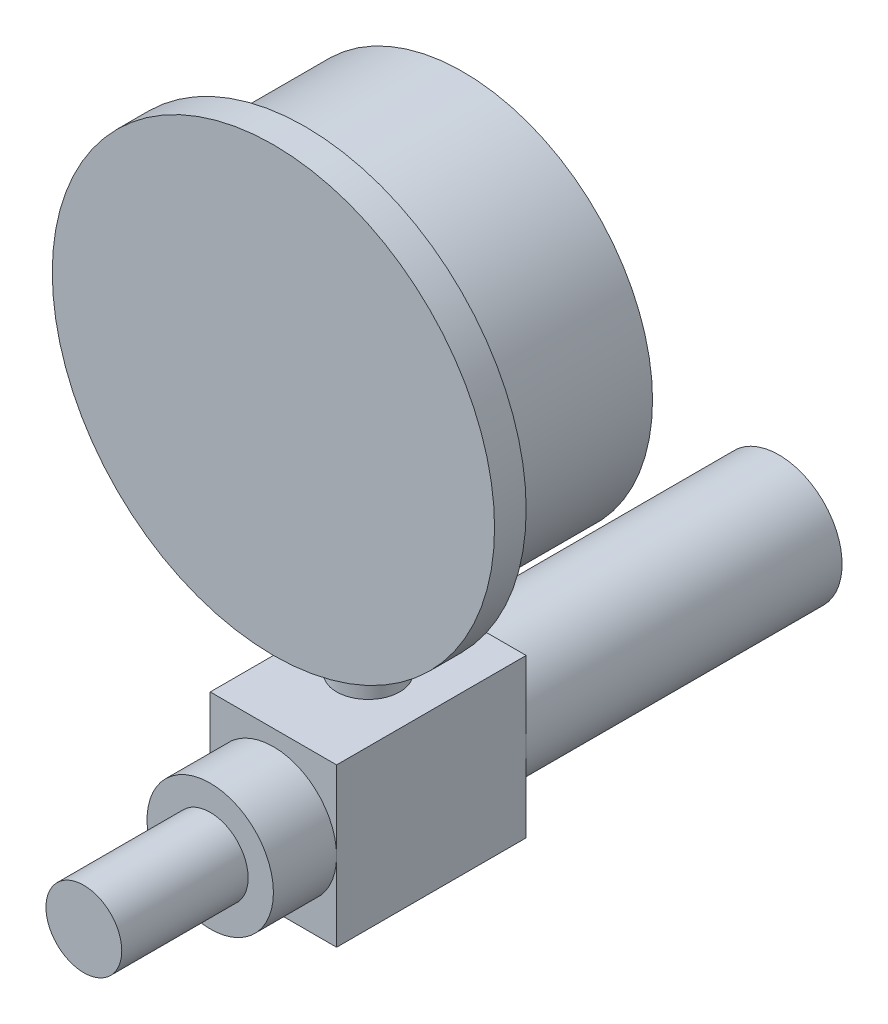
ISO-10303-21;
HEADER;
FILE_DESCRIPTION(('STEP AP214'),'2;1');
FILE_NAME('part.step','',(''),(''),'','','');
FILE_SCHEMA(('AUTOMOTIVE_DESIGN { 1 0 10303 214 1 1 1 1 }'));
ENDSEC;
DATA;
#1=APPLICATION_CONTEXT('core data for automotive mechanical design processes');
#2=APPLICATION_PROTOCOL_DEFINITION('international standard','automotive_design',2000,#1);
#3=PRODUCT_CONTEXT('',#1,'mechanical');
#4=PRODUCT('Part','Part','',(#3));
#5=PRODUCT_RELATED_PRODUCT_CATEGORY('part','',(#4));
#6=PRODUCT_DEFINITION_FORMATION('','',#4);
#7=PRODUCT_DEFINITION_CONTEXT('part definition',#1,'design');
#8=PRODUCT_DEFINITION('design','',#6,#7);
#9=PRODUCT_DEFINITION_SHAPE('','',#8);
#10=(LENGTH_UNIT() NAMED_UNIT(*) SI_UNIT(.MILLI.,.METRE.));
#11=(NAMED_UNIT(*) PLANE_ANGLE_UNIT() SI_UNIT($,.RADIAN.));
#12=(NAMED_UNIT(*) SI_UNIT($,.STERADIAN.) SOLID_ANGLE_UNIT());
#13=UNCERTAINTY_MEASURE_WITH_UNIT(LENGTH_MEASURE(1.E-05),#10,'distance_accuracy_value','');
#14=(GEOMETRIC_REPRESENTATION_CONTEXT(3) GLOBAL_UNCERTAINTY_ASSIGNED_CONTEXT((#13)) GLOBAL_UNIT_ASSIGNED_CONTEXT((#10,
#11,#12)) REPRESENTATION_CONTEXT('',''));
#15=CARTESIAN_POINT('',(0.,0.,0.));
#16=DIRECTION('',(0.,0.,1.));
#17=DIRECTION('',(1.,0.,0.));
#18=AXIS2_PLACEMENT_3D('',#15,#16,#17);
#19=CARTESIAN_POINT('',(0.,0.,-30.));
#20=DIRECTION('',(0.,0.,-1.));
#21=DIRECTION('',(-1.,0.,0.));
#22=AXIS2_PLACEMENT_3D('',#19,#20,#21);
#23=PLANE('',#22);
#24=CARTESIAN_POINT('',(0.,-37.5,-30.));
#25=DIRECTION('',(0.,0.,-1.));
#26=DIRECTION('',(-1.,0.,0.));
#27=AXIS2_PLACEMENT_3D('',#24,#25,#26);
#28=CIRCLE('',#27,10.);
#29=CARTESIAN_POINT('',(-10.,-37.5,-30.));
#30=VERTEX_POINT('',#29);
#31=CARTESIAN_POINT('',(10.,-37.5,-30.));
#32=VERTEX_POINT('',#31);
#33=EDGE_CURVE('E51',#30,#32,#28,.T.);
#34=ORIENTED_EDGE('',*,*,#33,.F.);
#35=DIRECTION('',(0.,-1.,0.));
#36=VECTOR('',#35,1.);
#37=CARTESIAN_POINT('',(-10.,-50.,-30.));
#38=LINE('',#37,#36);
#39=CARTESIAN_POINT('',(-10.,-25.,-30.));
#40=VERTEX_POINT('',#39);
#41=EDGE_CURVE('E95',#40,#30,#38,.T.);
#42=ORIENTED_EDGE('',*,*,#41,.F.);
#43=DIRECTION('',(-1.,0.,0.));
#44=VECTOR('',#43,1.);
#45=CARTESIAN_POINT('',(-10.,-25.,-30.));
#46=LINE('',#45,#44);
#47=CARTESIAN_POINT('',(10.,-25.,-30.));
#48=VERTEX_POINT('',#47);
#49=EDGE_CURVE('E192',#48,#40,#46,.T.);
#50=ORIENTED_EDGE('',*,*,#49,.F.);
#51=DIRECTION('',(0.,1.,0.));
#52=VECTOR('',#51,1.);
#53=CARTESIAN_POINT('',(10.,-50.,-30.));
#54=LINE('',#53,#52);
#55=EDGE_CURVE('E114',#32,#48,#54,.T.);
#56=ORIENTED_EDGE('',*,*,#55,.F.);
#57=EDGE_LOOP('',(#34,#42,#50,#56));
#58=FACE_BOUND('',#57,.T.);
#59=ADVANCED_FACE('F39',(#58),#23,.T.);
#60=CARTESIAN_POINT('',(0.,0.,0.));
#61=DIRECTION('',(0.,0.,-1.));
#62=DIRECTION('',(-1.,0.,0.));
#63=AXIS2_PLACEMENT_3D('',#60,#61,#62);
#64=PLANE('',#63);
#65=CARTESIAN_POINT('',(0.,-37.5,0.));
#66=DIRECTION('',(0.,0.,1.));
#67=DIRECTION('',(1.,0.,0.));
#68=AXIS2_PLACEMENT_3D('',#65,#66,#67);
#69=CIRCLE('',#68,10.);
#70=CARTESIAN_POINT('',(10.,-37.5,0.));
#71=VERTEX_POINT('',#70);
#72=CARTESIAN_POINT('',(-10.,-37.5,0.));
#73=VERTEX_POINT('',#72);
#74=EDGE_CURVE('E210',#71,#73,#69,.T.);
#75=ORIENTED_EDGE('',*,*,#74,.F.);
#76=DIRECTION('',(0.,1.,0.));
#77=VECTOR('',#76,1.);
#78=CARTESIAN_POINT('',(10.,-50.,0.));
#79=LINE('',#78,#77);
#80=CARTESIAN_POINT('',(10.,-25.,0.));
#81=VERTEX_POINT('',#80);
#82=EDGE_CURVE('E181',#71,#81,#79,.T.);
#83=ORIENTED_EDGE('',*,*,#82,.T.);
#84=DIRECTION('',(-1.,0.,0.));
#85=VECTOR('',#84,1.);
#86=CARTESIAN_POINT('',(-10.,-25.,0.));
#87=LINE('',#86,#85);
#88=CARTESIAN_POINT('',(-10.,-25.,0.));
#89=VERTEX_POINT('',#88);
#90=EDGE_CURVE('E112',#81,#89,#87,.T.);
#91=ORIENTED_EDGE('',*,*,#90,.T.);
#92=DIRECTION('',(0.,-1.,0.));
#93=VECTOR('',#92,1.);
#94=CARTESIAN_POINT('',(-10.,-50.,0.));
#95=LINE('',#94,#93);
#96=EDGE_CURVE('E200',#89,#73,#95,.T.);
#97=ORIENTED_EDGE('',*,*,#96,.T.);
#98=EDGE_LOOP('',(#75,#83,#91,#97));
#99=FACE_BOUND('',#98,.T.);
#100=ADVANCED_FACE('F136',(#99),#64,.F.);
#101=CARTESIAN_POINT('',(-10.,-50.,-30.));
#102=DIRECTION('',(-1.,0.,0.));
#103=DIRECTION('',(0.,-1.,0.));
#104=AXIS2_PLACEMENT_3D('',#101,#102,#103);
#105=PLANE('',#104);
#106=ORIENTED_EDGE('',*,*,#96,.F.);
#107=DIRECTION('',(0.,0.,1.));
#108=VECTOR('',#107,1.);
#109=CARTESIAN_POINT('',(-10.,-25.,-30.));
#110=LINE('',#109,#108);
#111=EDGE_CURVE('E100',#40,#89,#110,.T.);
#112=ORIENTED_EDGE('',*,*,#111,.F.);
#113=ORIENTED_EDGE('',*,*,#41,.T.);
#114=CARTESIAN_POINT('',(-10.,-50.,-30.));
#115=VERTEX_POINT('',#114);
#116=EDGE_CURVE('E98',#30,#115,#38,.T.);
#117=ORIENTED_EDGE('',*,*,#116,.T.);
#118=DIRECTION('',(0.,0.,1.));
#119=VECTOR('',#118,1.);
#120=CARTESIAN_POINT('',(-10.,-50.,-30.));
#121=LINE('',#120,#119);
#122=CARTESIAN_POINT('',(-10.,-50.,0.));
#123=VERTEX_POINT('',#122);
#124=EDGE_CURVE('E43',#115,#123,#121,.T.);
#125=ORIENTED_EDGE('',*,*,#124,.T.);
#126=EDGE_CURVE('E203',#73,#123,#95,.T.);
#127=ORIENTED_EDGE('',*,*,#126,.F.);
#128=EDGE_LOOP('',(#106,#112,#113,#117,#125,#127));
#129=FACE_BOUND('',#128,.T.);
#130=ADVANCED_FACE('F41',(#129),#105,.T.);
#131=CARTESIAN_POINT('',(-10.,-25.,-30.));
#132=DIRECTION('',(0.,1.,0.));
#133=DIRECTION('',(0.,0.,1.));
#134=AXIS2_PLACEMENT_3D('',#131,#132,#133);
#135=PLANE('',#134);
#136=CARTESIAN_POINT('',(0.,-25.,-15.));
#137=DIRECTION('',(0.,1.,0.));
#138=DIRECTION('',(0.,0.,1.));
#139=AXIS2_PLACEMENT_3D('',#136,#137,#138);
#140=CIRCLE('',#139,5.);
#141=CARTESIAN_POINT('',(0.,-25.,-10.));
#142=VERTEX_POINT('',#141);
#143=EDGE_CURVE('E170',#142,#142,#140,.T.);
#144=ORIENTED_EDGE('',*,*,#143,.F.);
#145=EDGE_LOOP('',(#144));
#146=FACE_BOUND('',#145,.T.);
#147=ORIENTED_EDGE('',*,*,#90,.F.);
#148=DIRECTION('',(0.,0.,1.));
#149=VECTOR('',#148,1.);
#150=CARTESIAN_POINT('',(10.,-25.,-30.));
#151=LINE('',#150,#149);
#152=EDGE_CURVE('E175',#48,#81,#151,.T.);
#153=ORIENTED_EDGE('',*,*,#152,.F.);
#154=ORIENTED_EDGE('',*,*,#49,.T.);
#155=ORIENTED_EDGE('',*,*,#111,.T.);
#156=EDGE_LOOP('',(#147,#153,#154,#155));
#157=FACE_BOUND('',#156,.T.);
#158=ADVANCED_FACE('F157',(#146,#157),#135,.T.);
#159=CARTESIAN_POINT('',(10.,-50.,-30.));
#160=DIRECTION('',(1.,0.,0.));
#161=DIRECTION('',(0.,1.,0.));
#162=AXIS2_PLACEMENT_3D('',#159,#160,#161);
#163=PLANE('',#162);
#164=CARTESIAN_POINT('',(10.,-50.,0.));
#165=VERTEX_POINT('',#164);
#166=EDGE_CURVE('E178',#165,#71,#79,.T.);
#167=ORIENTED_EDGE('',*,*,#166,.F.);
#168=DIRECTION('',(0.,0.,1.));
#169=VECTOR('',#168,1.);
#170=CARTESIAN_POINT('',(10.,-50.,-30.));
#171=LINE('',#170,#169);
#172=CARTESIAN_POINT('',(10.,-50.,-30.));
#173=VERTEX_POINT('',#172);
#174=EDGE_CURVE('E188',#173,#165,#171,.T.);
#175=ORIENTED_EDGE('',*,*,#174,.F.);
#176=EDGE_CURVE('E194',#173,#32,#54,.T.);
#177=ORIENTED_EDGE('',*,*,#176,.T.);
#178=ORIENTED_EDGE('',*,*,#55,.T.);
#179=ORIENTED_EDGE('',*,*,#152,.T.);
#180=ORIENTED_EDGE('',*,*,#82,.F.);
#181=EDGE_LOOP('',(#167,#175,#177,#178,#179,#180));
#182=FACE_BOUND('',#181,.T.);
#183=ADVANCED_FACE('F152',(#182),#163,.T.);
#184=CARTESIAN_POINT('',(-10.,-50.,-30.));
#185=DIRECTION('',(0.,-1.,0.));
#186=DIRECTION('',(0.,0.,-1.));
#187=AXIS2_PLACEMENT_3D('',#184,#185,#186);
#188=PLANE('',#187);
#189=DIRECTION('',(1.,0.,0.));
#190=VECTOR('',#189,1.);
#191=CARTESIAN_POINT('',(-10.,-50.,0.));
#192=LINE('',#191,#190);
#193=EDGE_CURVE('E202',#123,#165,#192,.T.);
#194=ORIENTED_EDGE('',*,*,#193,.F.);
#195=ORIENTED_EDGE('',*,*,#124,.F.);
#196=DIRECTION('',(1.,0.,0.));
#197=VECTOR('',#196,1.);
#198=CARTESIAN_POINT('',(-10.,-50.,-30.));
#199=LINE('',#198,#197);
#200=EDGE_CURVE('E106',#115,#173,#199,.T.);
#201=ORIENTED_EDGE('',*,*,#200,.T.);
#202=ORIENTED_EDGE('',*,*,#174,.T.);
#203=EDGE_LOOP('',(#194,#195,#201,#202));
#204=FACE_BOUND('',#203,.T.);
#205=ADVANCED_FACE('F146',(#204),#188,.T.);
#206=EDGE_CURVE('E11',#32,#30,#28,.T.);
#207=ORIENTED_EDGE('',*,*,#206,.F.);
#208=ORIENTED_EDGE('',*,*,#176,.F.);
#209=ORIENTED_EDGE('',*,*,#200,.F.);
#210=ORIENTED_EDGE('',*,*,#116,.F.);
#211=EDGE_LOOP('',(#207,#208,#209,#210));
#212=FACE_BOUND('',#211,.T.);
#213=ADVANCED_FACE('F109',(#212),#23,.T.);
#214=EDGE_CURVE('E64',#73,#71,#69,.T.);
#215=ORIENTED_EDGE('',*,*,#214,.F.);
#216=ORIENTED_EDGE('',*,*,#126,.T.);
#217=ORIENTED_EDGE('',*,*,#193,.T.);
#218=ORIENTED_EDGE('',*,*,#166,.T.);
#219=EDGE_LOOP('',(#215,#216,#217,#218));
#220=FACE_BOUND('',#219,.T.);
#221=ADVANCED_FACE('F143',(#220),#64,.F.);
#222=CARTESIAN_POINT('',(0.,55.002,-15.));
#223=DIRECTION('',(0.,-1.,0.));
#224=DIRECTION('',(0.,0.,-1.));
#225=AXIS2_PLACEMENT_3D('',#222,#223,#224);
#226=CYLINDRICAL_SURFACE('',#225,5.);
#227=CARTESIAN_POINT('',(0.,-9.99999999999998,-20.));
#228=CARTESIAN_POINT('',(0.139438730306518,-10.0000009341092,-20.000002148603));
#229=CARTESIAN_POINT('',(0.278848374995361,-9.99902604004436,-19.9941652443515));
#230=CARTESIAN_POINT('',(0.556708896140973,-9.99515571152383,-19.9708658164974));
#231=CARTESIAN_POINT('',(0.695159577308832,-9.99225989686322,-19.9534009913958));
#232=CARTESIAN_POINT('',(0.970150520344155,-9.98462516992588,-19.9069611871019));
#233=CARTESIAN_POINT('',(1.10668952072418,-9.97988509502494,-19.8779789470685));
#234=CARTESIAN_POINT('',(1.37685247096437,-9.96869302971329,-19.8087139445941));
#235=CARTESIAN_POINT('',(1.51047533178691,-9.96224041120128,-19.7684270356836));
#236=CARTESIAN_POINT('',(1.77365528085701,-9.94781288653683,-19.6769149986391));
#237=CARTESIAN_POINT('',(1.90321704710935,-9.93983981292923,-19.6257030293222));
#238=CARTESIAN_POINT('',(2.15759207174616,-9.92258437206564,-19.512668231626));
#239=CARTESIAN_POINT('',(2.28240355940393,-9.91330152252752,-19.4508414928787));
#240=CARTESIAN_POINT('',(2.52631223217171,-9.89369014600561,-19.3170688876174));
#241=CARTESIAN_POINT('',(2.64541222152925,-9.88336214008593,-19.2451280566014));
#242=CARTESIAN_POINT('',(2.87720075943645,-9.86193680357056,-19.0915826775771));
#243=CARTESIAN_POINT('',(2.98988690101178,-9.8508391875783,-19.0099745365835));
#244=CARTESIAN_POINT('',(3.20893550320274,-9.82809010615608,-18.8369740483396));
#245=CARTESIAN_POINT('',(3.3152386019937,-9.81643484852248,-18.7455070296461));
#246=CARTESIAN_POINT('',(3.51981905081324,-9.79297704999694,-18.5539441062719));
#247=CARTESIAN_POINT('',(3.6180934149484,-9.78117445617477,-18.4538450195095));
#248=CARTESIAN_POINT('',(3.80586900468401,-9.75776055317601,-18.2457655657288));
#249=CARTESIAN_POINT('',(3.8953728871565,-9.74614918696246,-18.137787602886));
#250=CARTESIAN_POINT('',(4.06505128766863,-9.72343671172235,-17.9146207574097));
#251=CARTESIAN_POINT('',(4.14522235269035,-9.71233579246758,-17.7994292299429));
#252=CARTESIAN_POINT('',(4.29606801839332,-9.69090163701941,-17.5619714746938));
#253=CARTESIAN_POINT('',(4.36668480543057,-9.68057323002082,-17.4396680682227));
#254=CARTESIAN_POINT('',(4.49737903615683,-9.66105105020164,-17.1894109133508));
#255=CARTESIAN_POINT('',(4.55745254274493,-9.65185770161606,-17.0614550764348));
#256=CARTESIAN_POINT('',(4.66655756396113,-9.63488312342849,-16.800880688985));
#257=CARTESIAN_POINT('',(4.7155937427807,-9.62710129761132,-16.6682641354877));
#258=CARTESIAN_POINT('',(4.80229722760728,-9.61317006788786,-16.399267690265));
#259=CARTESIAN_POINT('',(4.83996038282925,-9.60702126007862,-16.2628864443209));
#260=CARTESIAN_POINT('',(4.93477467758659,-9.59142279813948,-15.8521985241443));
#261=CARTESIAN_POINT('',(4.97488357358493,-9.58463860030628,-15.5736311346302));
#262=CARTESIAN_POINT('',(5.00784793424048,-9.57907554836931,-15.0137968416156));
#263=CARTESIAN_POINT('',(5.00070674304215,-9.58029612772408,-14.7325301305676));
#264=CARTESIAN_POINT('',(4.93978637434362,-9.59052942981103,-14.1781555214272));
#265=CARTESIAN_POINT('',(4.88648873937525,-9.59946169485635,-13.9049934062605));
#266=CARTESIAN_POINT('',(4.73550730524632,-9.62398967573426,-13.3715543508874));
#267=CARTESIAN_POINT('',(4.63782198375658,-9.63958562010467,-13.1112778529485));
#268=CARTESIAN_POINT('',(4.40035421574883,-9.67576964833755,-12.6095431662811));
#269=CARTESIAN_POINT('',(4.2603717536546,-9.69638135867444,-12.3681814058211));
#270=CARTESIAN_POINT('',(3.94242410922567,-9.74025835177088,-11.9121909809221));
#271=CARTESIAN_POINT('',(3.76445586128013,-9.76352384863144,-11.6975644763446));
#272=CARTESIAN_POINT('',(3.37296440409906,-9.81044056210515,-11.2983478878588));
#273=CARTESIAN_POINT('',(3.15902792232791,-9.83409298584114,-11.1141629788504));
#274=CARTESIAN_POINT('',(2.70307050338167,-9.87885202672633,-10.7842444587386));
#275=CARTESIAN_POINT('',(2.46104938526711,-9.89995862747191,-10.638511095385));
#276=CARTESIAN_POINT('',(1.95541183087793,-9.93727785818147,-10.3895955499796));
#277=CARTESIAN_POINT('',(1.6917774507324,-9.95348636823234,-10.2864491623958));
#278=CARTESIAN_POINT('',(1.15059669160235,-9.97915006016976,-10.1260115684498));
#279=CARTESIAN_POINT('',(0.873051478491171,-9.98860580699901,-10.0687165260712));
#280=CARTESIAN_POINT('',(0.315419802472563,-9.99962259686402,-10.0021572830593));
#281=CARTESIAN_POINT('',(0.0354014741699762,-10.0012750602152,-9.99233685528186));
#282=CARTESIAN_POINT('',(-0.522279545647736,-9.99674948846383,-10.0195226899631));
#283=CARTESIAN_POINT('',(-0.799942327386603,-9.9905717546544,-10.0565271506765));
#284=CARTESIAN_POINT('',(-1.3433123514886,-9.97113653859302,-10.1758496942886));
#285=CARTESIAN_POINT('',(-1.60908173821582,-9.95792209538418,-10.2578924003975));
#286=CARTESIAN_POINT('',(-2.12309376827574,-9.92588928974922,-10.4646690527828));
#287=CARTESIAN_POINT('',(-2.37133542643381,-9.90707061263767,-10.5894053964243));
#288=CARTESIAN_POINT('',(-2.84566138437113,-9.86569032362967,-10.8793021876995));
#289=CARTESIAN_POINT('',(-3.07153052223238,-9.84309710867727,-11.0448100811423));
#290=CARTESIAN_POINT('',(-3.49248715064582,-9.79676935690181,-11.4110748619791));
#291=CARTESIAN_POINT('',(-3.68757240338597,-9.77303473726867,-11.6118343097199));
#292=CARTESIAN_POINT('',(-4.04348563611056,-9.72680347052861,-12.0453942240347));
#293=CARTESIAN_POINT('',(-4.20393781021313,-9.70432219453323,-12.2785050605519));
#294=CARTESIAN_POINT('',(-4.48340433261341,-9.66343072376247,-12.7687092086503));
#295=CARTESIAN_POINT('',(-4.60241999444133,-9.64502039994538,-13.0258017596878));
#296=CARTESIAN_POINT('',(-4.79507773356378,-9.61446859732391,-13.5555673072775));
#297=CARTESIAN_POINT('',(-4.86890685306042,-9.60230131081201,-13.8281709011913));
#298=CARTESIAN_POINT('',(-4.96966691993878,-9.5855561119601,-14.3822855433753));
#299=CARTESIAN_POINT('',(-4.99660194454599,-9.580977539818,-14.6637958150838));
#300=CARTESIAN_POINT('',(-5.0012321244509,-9.58018854628734,-15.0844097834175));
#301=CARTESIAN_POINT('',(-4.99693975789018,-9.58091723440677,-15.2235369220243));
#302=CARTESIAN_POINT('',(-4.97678436801742,-9.58431602836539,-15.5009125844857));
#303=CARTESIAN_POINT('',(-4.96092569221814,-9.58698540474276,-15.6391614187853));
#304=CARTESIAN_POINT('',(-4.91774640529921,-9.59419266516685,-15.9138477892769));
#305=CARTESIAN_POINT('',(-4.89042170080803,-9.59873121649817,-16.0502846606349));
#306=CARTESIAN_POINT('',(-4.82453301754958,-9.60954231704009,-16.3202964548754));
#307=CARTESIAN_POINT('',(-4.7859730845885,-9.615814242021,-16.4538723894262));
#308=CARTESIAN_POINT('',(-4.6979342864003,-9.62990713078424,-16.7171686051217));
#309=CARTESIAN_POINT('',(-4.6484643566485,-9.63772682638164,-16.846891943521));
#310=CARTESIAN_POINT('',(-4.53896986674982,-9.65469302973838,-17.1016587264378));
#311=CARTESIAN_POINT('',(-4.47894908739059,-9.6638390620139,-17.226703827951));
#312=CARTESIAN_POINT('',(-4.34874498523013,-9.68320650438807,-17.4713614507995));
#313=CARTESIAN_POINT('',(-4.27855767862003,-9.69342833561305,-17.5909718182554));
#314=CARTESIAN_POINT('',(-4.12855715704193,-9.71465545896651,-17.8238615256318));
#315=CARTESIAN_POINT('',(-4.04874732556528,-9.72566047515545,-17.9371430705211));
#316=CARTESIAN_POINT('',(-3.87899685367997,-9.74829074088559,-18.1580086987021));
#317=CARTESIAN_POINT('',(-3.78894418512202,-9.75992193264992,-18.2655060901041));
#318=CARTESIAN_POINT('',(-3.60017574898997,-9.78334726382201,-18.472513396479));
#319=CARTESIAN_POINT('',(-3.50146308651917,-9.79514134355741,-18.5720261500963));
#320=CARTESIAN_POINT('',(-3.29596225179814,-9.81857359497954,-18.7624819299774));
#321=CARTESIAN_POINT('',(-3.18916929766622,-9.83021166947142,-18.8534198090311));
#322=CARTESIAN_POINT('',(-2.9683310868055,-9.85299525692812,-19.0259957161049));
#323=CARTESIAN_POINT('',(-2.8542885214692,-9.86414095011312,-19.1076371643346));
#324=CARTESIAN_POINT('',(-2.6188382428721,-9.88571163638665,-19.2616450304106));
#325=CARTESIAN_POINT('',(-2.49738284629917,-9.89613077517599,-19.3339393989323));
#326=CARTESIAN_POINT('',(-2.24876507402075,-9.91585865772619,-19.4679967471859));
#327=CARTESIAN_POINT('',(-2.1216048197654,-9.92516780962101,-19.5297636014166));
#328=CARTESIAN_POINT('',(-1.86251821435404,-9.94240908953461,-19.6423007062681));
#329=CARTESIAN_POINT('',(-1.73059524615479,-9.95034217259901,-19.6930785897747));
#330=CARTESIAN_POINT('',(-1.46288984328885,-9.96461132799208,-19.7832948188954));
#331=CARTESIAN_POINT('',(-1.32710824358209,-9.97094774293555,-19.8227355974939));
#332=CARTESIAN_POINT('',(-0.995492141379857,-9.98410831476407,-19.9039783011701));
#333=CARTESIAN_POINT('',(-0.798161887183511,-9.99003986349412,-19.9399436570318));
#334=CARTESIAN_POINT('',(-0.400534394814459,-9.9979850016837,-19.9879527577987));
#335=CARTESIAN_POINT('',(-0.20023720778345,-9.99999865859781,-19.9999969145569));
#336=CARTESIAN_POINT('',(0.,-9.99999999999998,-20.));
#337=B_SPLINE_CURVE_WITH_KNOTS('',3,(#227,#228,#229,#230,#231,#232,#233,#234,#235,#236,#237,
#238,#239,#240,#241,#242,#243,#244,#245,#246,#247,#248,#249,#250,#251,#252,#253,#254,#255,#256,
#257,#258,#259,#260,#261,#262,#263,#264,#265,#266,#267,#268,#269,#270,#271,#272,#273,#274,#275,
#276,#277,#278,#279,#280,#281,#282,#283,#284,#285,#286,#287,#288,#289,#290,#291,#292,#293,#294,
#295,#296,#297,#298,#299,#300,#301,#302,#303,#304,#305,#306,#307,#308,#309,#310,#311,#312,#313,
#314,#315,#316,#317,#318,#319,#320,#321,#322,#323,#324,#325,#326,#327,#328,#329,#330,#331,#332,
#333,#334,#335,#336),.UNSPECIFIED.,.T.,.F.,(4,2,2,2,2,2,2,2,2,2,2,2,2,2,2,2,2,2,2,2,2,2,2,2,2,2,
2,2,2,2,2,2,2,2,2,2,2,2,2,2,2,2,2,2,2,2,2,2,2,2,2,2,2,2,4),(0.,0.418140677636319,
0.836364141924731,1.25485168316257,1.67349292366114,2.09163274536574,2.50992693714591,
2.92801360569262,3.3462561521736,3.767924736377,4.18974943231197,4.61144594582073,
5.03329798883921,5.45759827861687,5.88205667621393,6.30633536657101,6.73076871826473,
7.57090272280958,8.41097726715884,9.24239161594928,10.0738344812487,10.9092723133923,
11.7447775943526,12.5906365789676,13.4365010134581,14.2830749590592,15.1295780711641,
15.9661388505691,16.8026674414583,17.6341373208694,18.4656538972624,19.3045176932816,
20.1434424418268,20.9910576208935,21.83864592826,22.6827016275766,23.5266839364735,
23.943862966713,24.3608852695982,24.7780565762499,25.1950778447662,25.6117588257789,
26.0282907967258,26.4449864317718,26.861535972448,27.2831832626946,27.7046799813851,
28.1264281209232,28.5480205921467,28.9726903230862,29.3972034214197,29.8214207018257,
30.2455468755531,30.846016796232,31.446476378491),.UNSPECIFIED.);
#338=CARTESIAN_POINT('',(0.,-9.99999999999998,-20.));
#339=VERTEX_POINT('',#338);
#340=EDGE_CURVE('E216',#339,#339,#337,.T.);
#341=ORIENTED_EDGE('',*,*,#340,.T.);
#342=EDGE_LOOP('',(#341));
#343=FACE_BOUND('',#342,.T.);
#344=ORIENTED_EDGE('',*,*,#143,.T.);
#345=EDGE_LOOP('',(#344));
#346=FACE_BOUND('',#345,.T.);
#347=ADVANCED_FACE('F151',(#343,#346),#226,.T.);
#348=CARTESIAN_POINT('',(0.,20.,-30.));
#349=DIRECTION('',(0.,0.,1.));
#350=DIRECTION('',(1.,0.,0.));
#351=AXIS2_PLACEMENT_3D('',#348,#349,#350);
#352=CYLINDRICAL_SURFACE('',#351,30.);
#353=CARTESIAN_POINT('',(0.,20.,-30.));
#354=DIRECTION('',(0.,0.,1.));
#355=DIRECTION('',(1.,0.,0.));
#356=AXIS2_PLACEMENT_3D('',#353,#354,#355);
#357=CIRCLE('',#356,30.);
#358=CARTESIAN_POINT('',(30.,20.,-30.));
#359=VERTEX_POINT('',#358);
#360=EDGE_CURVE('E224',#359,#359,#357,.T.);
#361=ORIENTED_EDGE('',*,*,#360,.T.);
#362=EDGE_LOOP('',(#361));
#363=FACE_BOUND('',#362,.T.);
#364=CARTESIAN_POINT('',(0.,20.,-5.));
#365=DIRECTION('',(0.,0.,1.));
#366=DIRECTION('',(1.,0.,0.));
#367=AXIS2_PLACEMENT_3D('',#364,#365,#366);
#368=CIRCLE('',#367,30.);
#369=CARTESIAN_POINT('',(30.,20.,-5.));
#370=VERTEX_POINT('',#369);
#371=EDGE_CURVE('E275',#370,#370,#368,.T.);
#372=ORIENTED_EDGE('',*,*,#371,.F.);
#373=EDGE_LOOP('',(#372));
#374=FACE_BOUND('',#373,.T.);
#375=ORIENTED_EDGE('',*,*,#340,.F.);
#376=EDGE_LOOP('',(#375));
#377=FACE_BOUND('',#376,.T.);
#378=ADVANCED_FACE('F227',(#363,#374,#377),#352,.T.);
#379=CARTESIAN_POINT('',(0.,20.,-30.));
#380=DIRECTION('',(0.,0.,1.));
#381=DIRECTION('',(1.,0.,0.));
#382=AXIS2_PLACEMENT_3D('',#379,#380,#381);
#383=PLANE('',#382);
#384=ORIENTED_EDGE('',*,*,#360,.F.);
#385=EDGE_LOOP('',(#384));
#386=FACE_BOUND('',#385,.T.);
#387=ADVANCED_FACE('F231',(#386),#383,.F.);
#388=CARTESIAN_POINT('',(0.,20.,-5.));
#389=DIRECTION('',(0.,0.,1.));
#390=DIRECTION('',(1.,0.,0.));
#391=AXIS2_PLACEMENT_3D('',#388,#389,#390);
#392=CYLINDRICAL_SURFACE('',#391,35.);
#393=CARTESIAN_POINT('',(0.,20.,-5.));
#394=DIRECTION('',(0.,0.,1.));
#395=DIRECTION('',(1.,0.,0.));
#396=AXIS2_PLACEMENT_3D('',#393,#394,#395);
#397=CIRCLE('',#396,35.);
#398=CARTESIAN_POINT('',(35.,20.,-5.));
#399=VERTEX_POINT('',#398);
#400=EDGE_CURVE('E282',#399,#399,#397,.T.);
#401=ORIENTED_EDGE('',*,*,#400,.T.);
#402=EDGE_LOOP('',(#401));
#403=FACE_BOUND('',#402,.T.);
#404=CARTESIAN_POINT('',(0.,20.,0.));
#405=DIRECTION('',(0.,0.,1.));
#406=DIRECTION('',(1.,0.,0.));
#407=AXIS2_PLACEMENT_3D('',#404,#405,#406);
#408=CIRCLE('',#407,35.);
#409=CARTESIAN_POINT('',(35.,20.,0.));
#410=VERTEX_POINT('',#409);
#411=EDGE_CURVE('E281',#410,#410,#408,.T.);
#412=ORIENTED_EDGE('',*,*,#411,.F.);
#413=EDGE_LOOP('',(#412));
#414=FACE_BOUND('',#413,.T.);
#415=ADVANCED_FACE('F241',(#403,#414),#392,.T.);
#416=CARTESIAN_POINT('',(0.,20.,-5.));
#417=DIRECTION('',(0.,0.,1.));
#418=DIRECTION('',(1.,0.,0.));
#419=AXIS2_PLACEMENT_3D('',#416,#417,#418);
#420=PLANE('',#419);
#421=ORIENTED_EDGE('',*,*,#371,.T.);
#422=EDGE_LOOP('',(#421));
#423=FACE_BOUND('',#422,.T.);
#424=ORIENTED_EDGE('',*,*,#400,.F.);
#425=EDGE_LOOP('',(#424));
#426=FACE_BOUND('',#425,.T.);
#427=ADVANCED_FACE('F237',(#423,#426),#420,.F.);
#428=CARTESIAN_POINT('',(0.,20.,0.));
#429=DIRECTION('',(0.,0.,1.));
#430=DIRECTION('',(1.,0.,0.));
#431=AXIS2_PLACEMENT_3D('',#428,#429,#430);
#432=PLANE('',#431);
#433=ORIENTED_EDGE('',*,*,#411,.T.);
#434=EDGE_LOOP('',(#433));
#435=FACE_BOUND('',#434,.T.);
#436=ADVANCED_FACE('F233',(#435),#432,.T.);
#437=CARTESIAN_POINT('',(0.,-37.5,10.));
#438=DIRECTION('',(0.,0.,-1.));
#439=DIRECTION('',(-1.,0.,0.));
#440=AXIS2_PLACEMENT_3D('',#437,#438,#439);
#441=CYLINDRICAL_SURFACE('',#440,10.);
#442=CARTESIAN_POINT('',(0.,-37.5,10.));
#443=DIRECTION('',(0.,0.,1.));
#444=DIRECTION('',(1.,0.,0.));
#445=AXIS2_PLACEMENT_3D('',#442,#443,#444);
#446=CIRCLE('',#445,10.);
#447=CARTESIAN_POINT('',(10.,-37.5,10.));
#448=VERTEX_POINT('',#447);
#449=EDGE_CURVE('E272',#448,#448,#446,.T.);
#450=ORIENTED_EDGE('',*,*,#449,.F.);
#451=EDGE_LOOP('',(#450));
#452=FACE_BOUND('',#451,.T.);
#453=ORIENTED_EDGE('',*,*,#74,.T.);
#454=ORIENTED_EDGE('',*,*,#214,.T.);
#455=EDGE_LOOP('',(#453,#454));
#456=FACE_BOUND('',#455,.T.);
#457=ADVANCED_FACE('F236',(#452,#456),#441,.T.);
#458=CARTESIAN_POINT('',(0.,-37.5,10.));
#459=DIRECTION('',(0.,0.,1.));
#460=DIRECTION('',(1.,0.,0.));
#461=AXIS2_PLACEMENT_3D('',#458,#459,#460);
#462=PLANE('',#461);
#463=CARTESIAN_POINT('',(0.,-37.5,10.));
#464=DIRECTION('',(0.,0.,1.));
#465=DIRECTION('',(1.,0.,0.));
#466=AXIS2_PLACEMENT_3D('',#463,#464,#465);
#467=CIRCLE('',#466,6.);
#468=CARTESIAN_POINT('',(6.,-37.5,10.));
#469=VERTEX_POINT('',#468);
#470=EDGE_CURVE('E49',#469,#469,#467,.T.);
#471=ORIENTED_EDGE('',*,*,#470,.F.);
#472=EDGE_LOOP('',(#471));
#473=FACE_BOUND('',#472,.T.);
#474=ORIENTED_EDGE('',*,*,#449,.T.);
#475=EDGE_LOOP('',(#474));
#476=FACE_BOUND('',#475,.T.);
#477=ADVANCED_FACE('F251',(#473,#476),#462,.T.);
#478=CARTESIAN_POINT('',(0.,-37.5,30.));
#479=DIRECTION('',(0.,0.,-1.));
#480=DIRECTION('',(-1.,0.,0.));
#481=AXIS2_PLACEMENT_3D('',#478,#479,#480);
#482=CYLINDRICAL_SURFACE('',#481,6.);
#483=CARTESIAN_POINT('',(0.,-37.5,30.));
#484=DIRECTION('',(0.,0.,1.));
#485=DIRECTION('',(1.,0.,0.));
#486=AXIS2_PLACEMENT_3D('',#483,#484,#485);
#487=CIRCLE('',#486,6.);
#488=CARTESIAN_POINT('',(6.,-37.5,30.));
#489=VERTEX_POINT('',#488);
#490=EDGE_CURVE('E263',#489,#489,#487,.T.);
#491=ORIENTED_EDGE('',*,*,#490,.F.);
#492=EDGE_LOOP('',(#491));
#493=FACE_BOUND('',#492,.T.);
#494=ORIENTED_EDGE('',*,*,#470,.T.);
#495=EDGE_LOOP('',(#494));
#496=FACE_BOUND('',#495,.T.);
#497=ADVANCED_FACE('F131',(#493,#496),#482,.T.);
#498=CARTESIAN_POINT('',(0.,-37.5,30.));
#499=DIRECTION('',(0.,0.,1.));
#500=DIRECTION('',(1.,0.,0.));
#501=AXIS2_PLACEMENT_3D('',#498,#499,#500);
#502=PLANE('',#501);
#503=ORIENTED_EDGE('',*,*,#490,.T.);
#504=EDGE_LOOP('',(#503));
#505=FACE_BOUND('',#504,.T.);
#506=ADVANCED_FACE('F122',(#505),#502,.T.);
#507=CARTESIAN_POINT('',(0.,-37.5,-80.));
#508=DIRECTION('',(0.,0.,1.));
#509=DIRECTION('',(1.,0.,0.));
#510=AXIS2_PLACEMENT_3D('',#507,#508,#509);
#511=CYLINDRICAL_SURFACE('',#510,10.);
#512=CARTESIAN_POINT('',(0.,-37.5,-80.));
#513=DIRECTION('',(0.,0.,-1.));
#514=DIRECTION('',(-1.,0.,0.));
#515=AXIS2_PLACEMENT_3D('',#512,#513,#514);
#516=CIRCLE('',#515,10.);
#517=CARTESIAN_POINT('',(-10.,-37.5,-80.));
#518=VERTEX_POINT('',#517);
#519=EDGE_CURVE('E118',#518,#518,#516,.T.);
#520=ORIENTED_EDGE('',*,*,#519,.F.);
#521=EDGE_LOOP('',(#520));
#522=FACE_BOUND('',#521,.T.);
#523=ORIENTED_EDGE('',*,*,#33,.T.);
#524=ORIENTED_EDGE('',*,*,#206,.T.);
#525=EDGE_LOOP('',(#523,#524));
#526=FACE_BOUND('',#525,.T.);
#527=ADVANCED_FACE('F119',(#522,#526),#511,.T.);
#528=CARTESIAN_POINT('',(0.,-37.5,-80.));
#529=DIRECTION('',(0.,0.,-1.));
#530=DIRECTION('',(-1.,0.,0.));
#531=AXIS2_PLACEMENT_3D('',#528,#529,#530);
#532=PLANE('',#531);
#533=ORIENTED_EDGE('',*,*,#519,.T.);
#534=EDGE_LOOP('',(#533));
#535=FACE_BOUND('',#534,.T.);
#536=ADVANCED_FACE('F121',(#535),#532,.T.);
#537=CLOSED_SHELL('',(#59,#100,#130,#158,#183,#205,#213,#221,#347,#378,#387,#415,#427,#436,#457,
#477,#497,#506,#527,#536));
#538=MANIFOLD_SOLID_BREP('B2',#537);
#539=ADVANCED_BREP_SHAPE_REPRESENTATION('',(#18,#538),#14);
#540=SHAPE_DEFINITION_REPRESENTATION(#9,#539);
ENDSEC;
END-ISO-10303-21;
